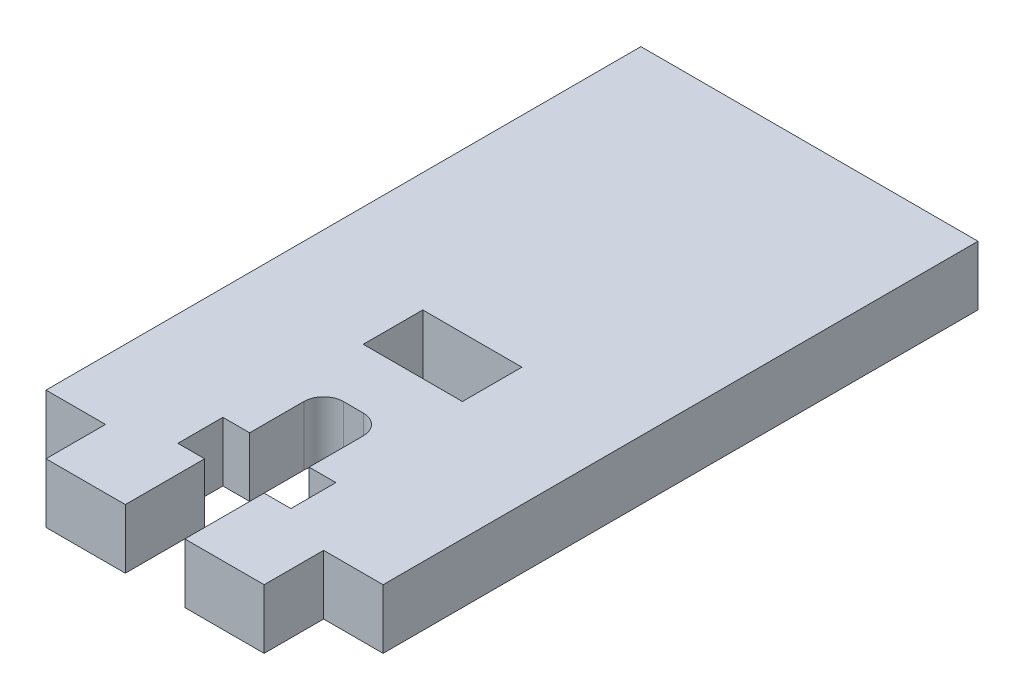
ISO-10303-21;
HEADER;
FILE_DESCRIPTION(('STEP AP214'),'2;1');
FILE_NAME('part.step','',(''),(''),'','','');
FILE_SCHEMA(('AUTOMOTIVE_DESIGN { 1 0 10303 214 1 1 1 1 }'));
ENDSEC;
DATA;
#1=APPLICATION_CONTEXT('core data for automotive mechanical design processes');
#2=APPLICATION_PROTOCOL_DEFINITION('international standard','automotive_design',2000,#1);
#3=PRODUCT_CONTEXT('',#1,'mechanical');
#4=PRODUCT('Part','Part','',(#3));
#5=PRODUCT_RELATED_PRODUCT_CATEGORY('part','',(#4));
#6=PRODUCT_DEFINITION_FORMATION('','',#4);
#7=PRODUCT_DEFINITION_CONTEXT('part definition',#1,'design');
#8=PRODUCT_DEFINITION('design','',#6,#7);
#9=PRODUCT_DEFINITION_SHAPE('','',#8);
#10=(LENGTH_UNIT() NAMED_UNIT(*) SI_UNIT(.MILLI.,.METRE.));
#11=(NAMED_UNIT(*) PLANE_ANGLE_UNIT() SI_UNIT($,.RADIAN.));
#12=(NAMED_UNIT(*) SI_UNIT($,.STERADIAN.) SOLID_ANGLE_UNIT());
#13=UNCERTAINTY_MEASURE_WITH_UNIT(LENGTH_MEASURE(1.E-05),#10,'distance_accuracy_value','');
#14=(GEOMETRIC_REPRESENTATION_CONTEXT(3) GLOBAL_UNCERTAINTY_ASSIGNED_CONTEXT((#13)) GLOBAL_UNIT_ASSIGNED_CONTEXT((#10,
#11,#12)) REPRESENTATION_CONTEXT('',''));
#15=CARTESIAN_POINT('',(0.,0.,0.));
#16=DIRECTION('',(0.,0.,1.));
#17=DIRECTION('',(1.,0.,0.));
#18=AXIS2_PLACEMENT_3D('',#15,#16,#17);
#19=CARTESIAN_POINT('',(-5.5,1.5,18.));
#20=DIRECTION('',(0.,0.,-1.));
#21=DIRECTION('',(-1.,0.,0.));
#22=AXIS2_PLACEMENT_3D('',#19,#20,#21);
#23=PLANE('',#22);
#24=DIRECTION('',(1.,0.,0.));
#25=VECTOR('',#24,1.);
#26=CARTESIAN_POINT('',(-5.5,-1.5,18.));
#27=LINE('',#26,#25);
#28=CARTESIAN_POINT('',(-5.5,-1.5,18.));
#29=VERTEX_POINT('',#28);
#30=CARTESIAN_POINT('',(-1.5,-1.5,18.));
#31=VERTEX_POINT('',#30);
#32=EDGE_CURVE('E227',#29,#31,#27,.T.);
#33=ORIENTED_EDGE('',*,*,#32,.T.);
#34=DIRECTION('',(0.,1.,0.));
#35=VECTOR('',#34,1.);
#36=CARTESIAN_POINT('',(-1.5,-1.5,18.));
#37=LINE('',#36,#35);
#38=CARTESIAN_POINT('',(-1.5,1.5,18.));
#39=VERTEX_POINT('',#38);
#40=EDGE_CURVE('E213',#31,#39,#37,.T.);
#41=ORIENTED_EDGE('',*,*,#40,.T.);
#42=DIRECTION('',(1.,0.,0.));
#43=VECTOR('',#42,1.);
#44=CARTESIAN_POINT('',(-5.5,1.5,18.));
#45=LINE('',#44,#43);
#46=CARTESIAN_POINT('',(-5.5,1.5,18.));
#47=VERTEX_POINT('',#46);
#48=EDGE_CURVE('E225',#47,#39,#45,.T.);
#49=ORIENTED_EDGE('',*,*,#48,.F.);
#50=DIRECTION('',(0.,-1.,0.));
#51=VECTOR('',#50,1.);
#52=CARTESIAN_POINT('',(-5.5,1.5,18.));
#53=LINE('',#52,#51);
#54=EDGE_CURVE('E259',#47,#29,#53,.T.);
#55=ORIENTED_EDGE('',*,*,#54,.T.);
#56=EDGE_LOOP('',(#33,#41,#49,#55));
#57=FACE_BOUND('',#56,.T.);
#58=ADVANCED_FACE('F37',(#57),#23,.F.);
#59=CARTESIAN_POINT('',(-8.5,1.5,15.));
#60=DIRECTION('',(0.,0.,-1.));
#61=DIRECTION('',(-1.,0.,0.));
#62=AXIS2_PLACEMENT_3D('',#59,#60,#61);
#63=PLANE('',#62);
#64=DIRECTION('',(0.,-1.,0.));
#65=VECTOR('',#64,1.);
#66=CARTESIAN_POINT('',(-5.5,1.5,15.));
#67=LINE('',#66,#65);
#68=CARTESIAN_POINT('',(-5.5,1.5,15.));
#69=VERTEX_POINT('',#68);
#70=CARTESIAN_POINT('',(-5.5,-1.5,15.));
#71=VERTEX_POINT('',#70);
#72=EDGE_CURVE('E239',#69,#71,#67,.T.);
#73=ORIENTED_EDGE('',*,*,#72,.F.);
#74=DIRECTION('',(1.,0.,0.));
#75=VECTOR('',#74,1.);
#76=CARTESIAN_POINT('',(-8.5,1.5,15.));
#77=LINE('',#76,#75);
#78=CARTESIAN_POINT('',(-8.5,1.5,15.));
#79=VERTEX_POINT('',#78);
#80=EDGE_CURVE('E267',#79,#69,#77,.T.);
#81=ORIENTED_EDGE('',*,*,#80,.F.);
#82=DIRECTION('',(0.,-1.,0.));
#83=VECTOR('',#82,1.);
#84=CARTESIAN_POINT('',(-8.5,1.5,15.));
#85=LINE('',#84,#83);
#86=CARTESIAN_POINT('',(-8.5,-1.5,15.));
#87=VERTEX_POINT('',#86);
#88=EDGE_CURVE('E11',#79,#87,#85,.T.);
#89=ORIENTED_EDGE('',*,*,#88,.T.);
#90=DIRECTION('',(1.,0.,0.));
#91=VECTOR('',#90,1.);
#92=CARTESIAN_POINT('',(-8.5,-1.5,15.));
#93=LINE('',#92,#91);
#94=EDGE_CURVE('E277',#87,#71,#93,.T.);
#95=ORIENTED_EDGE('',*,*,#94,.T.);
#96=EDGE_LOOP('',(#73,#81,#89,#95));
#97=FACE_BOUND('',#96,.T.);
#98=ADVANCED_FACE('F381',(#97),#63,.F.);
#99=CARTESIAN_POINT('',(-8.5,1.5,-15.));
#100=DIRECTION('',(1.,0.,0.));
#101=DIRECTION('',(0.,0.,-1.));
#102=AXIS2_PLACEMENT_3D('',#99,#100,#101);
#103=PLANE('',#102);
#104=DIRECTION('',(0.,0.,1.));
#105=VECTOR('',#104,1.);
#106=CARTESIAN_POINT('',(-8.5,-1.5,-15.));
#107=LINE('',#106,#105);
#108=CARTESIAN_POINT('',(-8.5,-1.5,-15.));
#109=VERTEX_POINT('',#108);
#110=EDGE_CURVE('E261',#109,#87,#107,.T.);
#111=ORIENTED_EDGE('',*,*,#110,.T.);
#112=ORIENTED_EDGE('',*,*,#88,.F.);
#113=DIRECTION('',(0.,0.,1.));
#114=VECTOR('',#113,1.);
#115=CARTESIAN_POINT('',(-8.5,1.5,-15.));
#116=LINE('',#115,#114);
#117=CARTESIAN_POINT('',(-8.5,1.5,-15.));
#118=VERTEX_POINT('',#117);
#119=EDGE_CURVE('E262',#118,#79,#116,.T.);
#120=ORIENTED_EDGE('',*,*,#119,.F.);
#121=DIRECTION('',(0.,-1.,0.));
#122=VECTOR('',#121,1.);
#123=CARTESIAN_POINT('',(-8.5,1.5,-15.));
#124=LINE('',#123,#122);
#125=EDGE_CURVE('E273',#118,#109,#124,.T.);
#126=ORIENTED_EDGE('',*,*,#125,.T.);
#127=EDGE_LOOP('',(#111,#112,#120,#126));
#128=FACE_BOUND('',#127,.T.);
#129=ADVANCED_FACE('F39',(#128),#103,.F.);
#130=CARTESIAN_POINT('',(5.5,1.5,15.));
#131=VERTEX_POINT('',#130);
#132=CARTESIAN_POINT('',(8.5,1.5,15.));
#133=VERTEX_POINT('',#132);
#134=EDGE_CURVE('E265',#131,#133,#77,.T.);
#135=ORIENTED_EDGE('',*,*,#134,.F.);
#136=DIRECTION('',(0.,-1.,0.));
#137=VECTOR('',#136,1.);
#138=CARTESIAN_POINT('',(5.5,1.5,15.));
#139=LINE('',#138,#137);
#140=CARTESIAN_POINT('',(5.5,-1.5,15.));
#141=VERTEX_POINT('',#140);
#142=EDGE_CURVE('E253',#131,#141,#139,.T.);
#143=ORIENTED_EDGE('',*,*,#142,.T.);
#144=CARTESIAN_POINT('',(8.5,-1.5,15.));
#145=VERTEX_POINT('',#144);
#146=EDGE_CURVE('E276',#141,#145,#93,.T.);
#147=ORIENTED_EDGE('',*,*,#146,.T.);
#148=DIRECTION('',(0.,-1.,0.));
#149=VECTOR('',#148,1.);
#150=CARTESIAN_POINT('',(8.5,1.5,15.));
#151=LINE('',#150,#149);
#152=EDGE_CURVE('E45',#133,#145,#151,.T.);
#153=ORIENTED_EDGE('',*,*,#152,.F.);
#154=EDGE_LOOP('',(#135,#143,#147,#153));
#155=FACE_BOUND('',#154,.T.);
#156=ADVANCED_FACE('F312',(#155),#63,.F.);
#157=CARTESIAN_POINT('',(8.5,1.5,-15.));
#158=DIRECTION('',(-1.,0.,0.));
#159=DIRECTION('',(0.,0.,1.));
#160=AXIS2_PLACEMENT_3D('',#157,#158,#159);
#161=PLANE('',#160);
#162=DIRECTION('',(0.,0.,-1.));
#163=VECTOR('',#162,1.);
#164=CARTESIAN_POINT('',(8.5,-1.5,-15.));
#165=LINE('',#164,#163);
#166=CARTESIAN_POINT('',(8.5,-1.5,-15.));
#167=VERTEX_POINT('',#166);
#168=EDGE_CURVE('E280',#145,#167,#165,.T.);
#169=ORIENTED_EDGE('',*,*,#168,.T.);
#170=DIRECTION('',(0.,-1.,0.));
#171=VECTOR('',#170,1.);
#172=CARTESIAN_POINT('',(8.5,1.5,-15.));
#173=LINE('',#172,#171);
#174=CARTESIAN_POINT('',(8.5,1.5,-15.));
#175=VERTEX_POINT('',#174);
#176=EDGE_CURVE('E285',#175,#167,#173,.T.);
#177=ORIENTED_EDGE('',*,*,#176,.F.);
#178=DIRECTION('',(0.,0.,-1.));
#179=VECTOR('',#178,1.);
#180=CARTESIAN_POINT('',(8.5,1.5,-15.));
#181=LINE('',#180,#179);
#182=EDGE_CURVE('E269',#133,#175,#181,.T.);
#183=ORIENTED_EDGE('',*,*,#182,.F.);
#184=ORIENTED_EDGE('',*,*,#152,.T.);
#185=EDGE_LOOP('',(#169,#177,#183,#184));
#186=FACE_BOUND('',#185,.T.);
#187=ADVANCED_FACE('F292',(#186),#161,.F.);
#188=CARTESIAN_POINT('',(-8.5,1.5,-15.));
#189=DIRECTION('',(0.,0.,1.));
#190=DIRECTION('',(1.,0.,0.));
#191=AXIS2_PLACEMENT_3D('',#188,#189,#190);
#192=PLANE('',#191);
#193=DIRECTION('',(-1.,0.,0.));
#194=VECTOR('',#193,1.);
#195=CARTESIAN_POINT('',(-8.5,-1.5,-15.));
#196=LINE('',#195,#194);
#197=EDGE_CURVE('E266',#167,#109,#196,.T.);
#198=ORIENTED_EDGE('',*,*,#197,.T.);
#199=ORIENTED_EDGE('',*,*,#125,.F.);
#200=DIRECTION('',(-1.,0.,0.));
#201=VECTOR('',#200,1.);
#202=CARTESIAN_POINT('',(-8.5,1.5,-15.));
#203=LINE('',#202,#201);
#204=EDGE_CURVE('E271',#175,#118,#203,.T.);
#205=ORIENTED_EDGE('',*,*,#204,.F.);
#206=ORIENTED_EDGE('',*,*,#176,.T.);
#207=EDGE_LOOP('',(#198,#199,#205,#206));
#208=FACE_BOUND('',#207,.T.);
#209=ADVANCED_FACE('F305',(#208),#192,.F.);
#210=CARTESIAN_POINT('',(0.,1.5,0.));
#211=DIRECTION('',(0.,1.,0.));
#212=DIRECTION('',(0.,0.,1.));
#213=AXIS2_PLACEMENT_3D('',#210,#211,#212);
#214=PLANE('',#213);
#215=DIRECTION('',(0.,0.,1.));
#216=VECTOR('',#215,1.);
#217=CARTESIAN_POINT('',(-1.5,1.5,18.));
#218=LINE('',#217,#216);
#219=CARTESIAN_POINT('',(-1.5,1.5,14.));
#220=VERTEX_POINT('',#219);
#221=EDGE_CURVE('E209',#220,#39,#218,.T.);
#222=ORIENTED_EDGE('',*,*,#221,.F.);
#223=DIRECTION('',(1.,0.,0.));
#224=VECTOR('',#223,1.);
#225=CARTESIAN_POINT('',(-2.85,1.5,14.));
#226=LINE('',#225,#224);
#227=CARTESIAN_POINT('',(-2.85,1.5,14.));
#228=VERTEX_POINT('',#227);
#229=EDGE_CURVE('E701',#228,#220,#226,.T.);
#230=ORIENTED_EDGE('',*,*,#229,.F.);
#231=DIRECTION('',(0.,0.,1.));
#232=VECTOR('',#231,1.);
#233=CARTESIAN_POINT('',(-2.85,1.5,11.73));
#234=LINE('',#233,#232);
#235=CARTESIAN_POINT('',(-2.85,1.5,11.73));
#236=VERTEX_POINT('',#235);
#237=EDGE_CURVE('E698',#236,#228,#234,.T.);
#238=ORIENTED_EDGE('',*,*,#237,.F.);
#239=DIRECTION('',(-1.,0.,0.));
#240=VECTOR('',#239,1.);
#241=CARTESIAN_POINT('',(-2.85,1.5,11.73));
#242=LINE('',#241,#240);
#243=CARTESIAN_POINT('',(-1.5,1.5,11.73));
#244=VERTEX_POINT('',#243);
#245=EDGE_CURVE('E695',#244,#236,#242,.T.);
#246=ORIENTED_EDGE('',*,*,#245,.F.);
#247=DIRECTION('',(0.,0.,1.));
#248=VECTOR('',#247,1.);
#249=CARTESIAN_POINT('',(-1.5,1.5,11.73));
#250=LINE('',#249,#248);
#251=CARTESIAN_POINT('',(-1.5,1.5,9.00000000000001));
#252=VERTEX_POINT('',#251);
#253=EDGE_CURVE('E692',#252,#244,#250,.T.);
#254=ORIENTED_EDGE('',*,*,#253,.F.);
#255=CARTESIAN_POINT('',(-0.500000000000001,1.5,9.));
#256=DIRECTION('',(0.,1.,0.));
#257=DIRECTION('',(0.,0.,-1.));
#258=AXIS2_PLACEMENT_3D('',#255,#256,#257);
#259=CIRCLE('',#258,1.);
#260=CARTESIAN_POINT('',(-0.499999999999993,1.5,8.));
#261=VERTEX_POINT('',#260);
#262=EDGE_CURVE('E689',#261,#252,#259,.T.);
#263=ORIENTED_EDGE('',*,*,#262,.F.);
#264=DIRECTION('',(-1.,0.,0.));
#265=VECTOR('',#264,1.);
#266=CARTESIAN_POINT('',(-0.499999999999993,1.5,8.));
#267=LINE('',#266,#265);
#268=CARTESIAN_POINT('',(0.499999999999993,1.5,8.));
#269=VERTEX_POINT('',#268);
#270=EDGE_CURVE('E686',#269,#261,#267,.T.);
#271=ORIENTED_EDGE('',*,*,#270,.F.);
#272=CARTESIAN_POINT('',(0.5,1.5,9.));
#273=DIRECTION('',(0.,1.,0.));
#274=DIRECTION('',(0.,0.,-1.));
#275=AXIS2_PLACEMENT_3D('',#272,#273,#274);
#276=CIRCLE('',#275,1.);
#277=CARTESIAN_POINT('',(1.5,1.5,9.00000000000001));
#278=VERTEX_POINT('',#277);
#279=EDGE_CURVE('E683',#278,#269,#276,.T.);
#280=ORIENTED_EDGE('',*,*,#279,.F.);
#281=DIRECTION('',(0.,0.,-1.));
#282=VECTOR('',#281,1.);
#283=CARTESIAN_POINT('',(1.5,1.5,11.73));
#284=LINE('',#283,#282);
#285=CARTESIAN_POINT('',(1.5,1.5,11.73));
#286=VERTEX_POINT('',#285);
#287=EDGE_CURVE('E677',#286,#278,#284,.T.);
#288=ORIENTED_EDGE('',*,*,#287,.F.);
#289=DIRECTION('',(-1.,0.,0.));
#290=VECTOR('',#289,1.);
#291=CARTESIAN_POINT('',(1.5,1.5,11.73));
#292=LINE('',#291,#290);
#293=CARTESIAN_POINT('',(2.85,1.5,11.73));
#294=VERTEX_POINT('',#293);
#295=EDGE_CURVE('E675',#294,#286,#292,.T.);
#296=ORIENTED_EDGE('',*,*,#295,.F.);
#297=DIRECTION('',(0.,0.,-1.));
#298=VECTOR('',#297,1.);
#299=CARTESIAN_POINT('',(2.85,1.5,11.73));
#300=LINE('',#299,#298);
#301=CARTESIAN_POINT('',(2.85,1.5,14.));
#302=VERTEX_POINT('',#301);
#303=EDGE_CURVE('E669',#302,#294,#300,.T.);
#304=ORIENTED_EDGE('',*,*,#303,.F.);
#305=DIRECTION('',(1.,0.,0.));
#306=VECTOR('',#305,1.);
#307=CARTESIAN_POINT('',(1.5,1.5,14.));
#308=LINE('',#307,#306);
#309=CARTESIAN_POINT('',(1.5,1.5,14.));
#310=VERTEX_POINT('',#309);
#311=EDGE_CURVE('E671',#310,#302,#308,.T.);
#312=ORIENTED_EDGE('',*,*,#311,.F.);
#313=DIRECTION('',(0.,0.,-1.));
#314=VECTOR('',#313,1.);
#315=CARTESIAN_POINT('',(1.5,1.5,18.));
#316=LINE('',#315,#314);
#317=CARTESIAN_POINT('',(1.5,1.5,18.));
#318=VERTEX_POINT('',#317);
#319=EDGE_CURVE('E220',#318,#310,#316,.T.);
#320=ORIENTED_EDGE('',*,*,#319,.F.);
#321=CARTESIAN_POINT('',(5.5,1.5,18.));
#322=VERTEX_POINT('',#321);
#323=EDGE_CURVE('E237',#318,#322,#45,.T.);
#324=ORIENTED_EDGE('',*,*,#323,.T.);
#325=DIRECTION('',(0.,0.,-1.));
#326=VECTOR('',#325,1.);
#327=CARTESIAN_POINT('',(5.5,1.5,15.));
#328=LINE('',#327,#326);
#329=EDGE_CURVE('E236',#322,#131,#328,.T.);
#330=ORIENTED_EDGE('',*,*,#329,.T.);
#331=ORIENTED_EDGE('',*,*,#134,.T.);
#332=ORIENTED_EDGE('',*,*,#182,.T.);
#333=ORIENTED_EDGE('',*,*,#204,.T.);
#334=ORIENTED_EDGE('',*,*,#119,.T.);
#335=ORIENTED_EDGE('',*,*,#80,.T.);
#336=DIRECTION('',(0.,0.,1.));
#337=VECTOR('',#336,1.);
#338=CARTESIAN_POINT('',(-5.5,1.5,15.));
#339=LINE('',#338,#337);
#340=EDGE_CURVE('E234',#69,#47,#339,.T.);
#341=ORIENTED_EDGE('',*,*,#340,.T.);
#342=ORIENTED_EDGE('',*,*,#48,.T.);
#343=EDGE_LOOP('',(#222,#230,#238,#246,#254,#263,#271,#280,#288,#296,#304,#312,#320,#324,#330,
#331,#332,#333,#334,#335,#341,#342));
#344=FACE_BOUND('',#343,.T.);
#345=DIRECTION('',(0.,0.,1.));
#346=VECTOR('',#345,1.);
#347=CARTESIAN_POINT('',(-2.5,1.5,2.));
#348=LINE('',#347,#346);
#349=CARTESIAN_POINT('',(-2.5,1.5,2.));
#350=VERTEX_POINT('',#349);
#351=CARTESIAN_POINT('',(-2.5,1.5,5.));
#352=VERTEX_POINT('',#351);
#353=EDGE_CURVE('E60',#350,#352,#348,.T.);
#354=ORIENTED_EDGE('',*,*,#353,.F.);
#355=DIRECTION('',(-1.,0.,0.));
#356=VECTOR('',#355,1.);
#357=CARTESIAN_POINT('',(-2.5,1.5,2.));
#358=LINE('',#357,#356);
#359=CARTESIAN_POINT('',(2.5,1.5,2.));
#360=VERTEX_POINT('',#359);
#361=EDGE_CURVE('E336',#360,#350,#358,.T.);
#362=ORIENTED_EDGE('',*,*,#361,.F.);
#363=DIRECTION('',(0.,0.,-1.));
#364=VECTOR('',#363,1.);
#365=CARTESIAN_POINT('',(2.5,1.5,2.));
#366=LINE('',#365,#364);
#367=CARTESIAN_POINT('',(2.5,1.5,5.));
#368=VERTEX_POINT('',#367);
#369=EDGE_CURVE('E333',#368,#360,#366,.T.);
#370=ORIENTED_EDGE('',*,*,#369,.F.);
#371=DIRECTION('',(1.,0.,0.));
#372=VECTOR('',#371,1.);
#373=CARTESIAN_POINT('',(-2.5,1.5,5.));
#374=LINE('',#373,#372);
#375=EDGE_CURVE('E330',#352,#368,#374,.T.);
#376=ORIENTED_EDGE('',*,*,#375,.F.);
#377=EDGE_LOOP('',(#354,#362,#370,#376));
#378=FACE_BOUND('',#377,.T.);
#379=ADVANCED_FACE('F231',(#344,#378),#214,.T.);
#380=CARTESIAN_POINT('',(0.,-1.5,0.));
#381=DIRECTION('',(0.,1.,0.));
#382=DIRECTION('',(0.,0.,1.));
#383=AXIS2_PLACEMENT_3D('',#380,#381,#382);
#384=PLANE('',#383);
#385=DIRECTION('',(-1.,0.,0.));
#386=VECTOR('',#385,1.);
#387=CARTESIAN_POINT('',(-2.5,-1.5,2.));
#388=LINE('',#387,#386);
#389=CARTESIAN_POINT('',(2.5,-1.5,2.));
#390=VERTEX_POINT('',#389);
#391=CARTESIAN_POINT('',(-2.5,-1.5,2.));
#392=VERTEX_POINT('',#391);
#393=EDGE_CURVE('E348',#390,#392,#388,.T.);
#394=ORIENTED_EDGE('',*,*,#393,.T.);
#395=DIRECTION('',(0.,0.,1.));
#396=VECTOR('',#395,1.);
#397=CARTESIAN_POINT('',(-2.5,-1.5,2.));
#398=LINE('',#397,#396);
#399=CARTESIAN_POINT('',(-2.5,-1.5,5.));
#400=VERTEX_POINT('',#399);
#401=EDGE_CURVE('E339',#392,#400,#398,.T.);
#402=ORIENTED_EDGE('',*,*,#401,.T.);
#403=DIRECTION('',(1.,0.,0.));
#404=VECTOR('',#403,1.);
#405=CARTESIAN_POINT('',(-2.5,-1.5,5.));
#406=LINE('',#405,#404);
#407=CARTESIAN_POINT('',(2.5,-1.5,5.));
#408=VERTEX_POINT('',#407);
#409=EDGE_CURVE('E342',#400,#408,#406,.T.);
#410=ORIENTED_EDGE('',*,*,#409,.T.);
#411=DIRECTION('',(0.,0.,-1.));
#412=VECTOR('',#411,1.);
#413=CARTESIAN_POINT('',(2.5,-1.5,2.));
#414=LINE('',#413,#412);
#415=EDGE_CURVE('E345',#408,#390,#414,.T.);
#416=ORIENTED_EDGE('',*,*,#415,.T.);
#417=EDGE_LOOP('',(#394,#402,#410,#416));
#418=FACE_BOUND('',#417,.T.);
#419=DIRECTION('',(1.,0.,0.));
#420=VECTOR('',#419,1.);
#421=CARTESIAN_POINT('',(-2.85,-1.5,14.));
#422=LINE('',#421,#420);
#423=CARTESIAN_POINT('',(-2.85,-1.5,14.));
#424=VERTEX_POINT('',#423);
#425=CARTESIAN_POINT('',(-1.5,-1.5,14.));
#426=VERTEX_POINT('',#425);
#427=EDGE_CURVE('E229',#424,#426,#422,.T.);
#428=ORIENTED_EDGE('',*,*,#427,.T.);
#429=DIRECTION('',(0.,0.,1.));
#430=VECTOR('',#429,1.);
#431=CARTESIAN_POINT('',(-1.5,-1.5,18.));
#432=LINE('',#431,#430);
#433=EDGE_CURVE('E621',#426,#31,#432,.T.);
#434=ORIENTED_EDGE('',*,*,#433,.T.);
#435=ORIENTED_EDGE('',*,*,#32,.F.);
#436=DIRECTION('',(0.,0.,1.));
#437=VECTOR('',#436,1.);
#438=CARTESIAN_POINT('',(-5.5,-1.5,15.));
#439=LINE('',#438,#437);
#440=EDGE_CURVE('E244',#71,#29,#439,.T.);
#441=ORIENTED_EDGE('',*,*,#440,.F.);
#442=ORIENTED_EDGE('',*,*,#94,.F.);
#443=ORIENTED_EDGE('',*,*,#110,.F.);
#444=ORIENTED_EDGE('',*,*,#197,.F.);
#445=ORIENTED_EDGE('',*,*,#168,.F.);
#446=ORIENTED_EDGE('',*,*,#146,.F.);
#447=DIRECTION('',(0.,0.,-1.));
#448=VECTOR('',#447,1.);
#449=CARTESIAN_POINT('',(5.5,-1.5,15.));
#450=LINE('',#449,#448);
#451=CARTESIAN_POINT('',(5.5,-1.5,18.));
#452=VERTEX_POINT('',#451);
#453=EDGE_CURVE('E250',#452,#141,#450,.T.);
#454=ORIENTED_EDGE('',*,*,#453,.F.);
#455=CARTESIAN_POINT('',(1.5,-1.5,18.));
#456=VERTEX_POINT('',#455);
#457=EDGE_CURVE('E247',#456,#452,#27,.T.);
#458=ORIENTED_EDGE('',*,*,#457,.F.);
#459=DIRECTION('',(0.,0.,-1.));
#460=VECTOR('',#459,1.);
#461=CARTESIAN_POINT('',(1.5,-1.5,18.));
#462=LINE('',#461,#460);
#463=CARTESIAN_POINT('',(1.5,-1.5,14.));
#464=VERTEX_POINT('',#463);
#465=EDGE_CURVE('E52',#456,#464,#462,.T.);
#466=ORIENTED_EDGE('',*,*,#465,.T.);
#467=DIRECTION('',(1.,0.,0.));
#468=VECTOR('',#467,1.);
#469=CARTESIAN_POINT('',(1.5,-1.5,14.));
#470=LINE('',#469,#468);
#471=CARTESIAN_POINT('',(2.85,-1.5,14.));
#472=VERTEX_POINT('',#471);
#473=EDGE_CURVE('E614',#464,#472,#470,.T.);
#474=ORIENTED_EDGE('',*,*,#473,.T.);
#475=DIRECTION('',(0.,0.,-1.));
#476=VECTOR('',#475,1.);
#477=CARTESIAN_POINT('',(2.85,-1.5,11.73));
#478=LINE('',#477,#476);
#479=CARTESIAN_POINT('',(2.85,-1.5,11.73));
#480=VERTEX_POINT('',#479);
#481=EDGE_CURVE('E617',#472,#480,#478,.T.);
#482=ORIENTED_EDGE('',*,*,#481,.T.);
#483=DIRECTION('',(-1.,0.,0.));
#484=VECTOR('',#483,1.);
#485=CARTESIAN_POINT('',(1.5,-1.5,11.73));
#486=LINE('',#485,#484);
#487=CARTESIAN_POINT('',(1.5,-1.5,11.73));
#488=VERTEX_POINT('',#487);
#489=EDGE_CURVE('E619',#480,#488,#486,.T.);
#490=ORIENTED_EDGE('',*,*,#489,.T.);
#491=DIRECTION('',(0.,0.,-1.));
#492=VECTOR('',#491,1.);
#493=CARTESIAN_POINT('',(1.5,-1.5,11.73));
#494=LINE('',#493,#492);
#495=CARTESIAN_POINT('',(1.5,-1.5,9.00000000000001));
#496=VERTEX_POINT('',#495);
#497=EDGE_CURVE('E627',#488,#496,#494,.T.);
#498=ORIENTED_EDGE('',*,*,#497,.T.);
#499=CARTESIAN_POINT('',(0.5,-1.5,9.));
#500=DIRECTION('',(0.,1.,0.));
#501=DIRECTION('',(0.,0.,-1.));
#502=AXIS2_PLACEMENT_3D('',#499,#500,#501);
#503=CIRCLE('',#502,1.);
#504=CARTESIAN_POINT('',(0.499999999999993,-1.5,8.));
#505=VERTEX_POINT('',#504);
#506=EDGE_CURVE('E630',#496,#505,#503,.T.);
#507=ORIENTED_EDGE('',*,*,#506,.T.);
#508=DIRECTION('',(-1.,0.,0.));
#509=VECTOR('',#508,1.);
#510=CARTESIAN_POINT('',(-0.499999999999993,-1.5,8.));
#511=LINE('',#510,#509);
#512=CARTESIAN_POINT('',(-0.499999999999993,-1.5,8.));
#513=VERTEX_POINT('',#512);
#514=EDGE_CURVE('E633',#505,#513,#511,.T.);
#515=ORIENTED_EDGE('',*,*,#514,.T.);
#516=CARTESIAN_POINT('',(-0.500000000000001,-1.5,9.));
#517=DIRECTION('',(0.,1.,0.));
#518=DIRECTION('',(0.,0.,-1.));
#519=AXIS2_PLACEMENT_3D('',#516,#517,#518);
#520=CIRCLE('',#519,1.);
#521=CARTESIAN_POINT('',(-1.5,-1.5,9.00000000000001));
#522=VERTEX_POINT('',#521);
#523=EDGE_CURVE('E636',#513,#522,#520,.T.);
#524=ORIENTED_EDGE('',*,*,#523,.T.);
#525=DIRECTION('',(0.,0.,1.));
#526=VECTOR('',#525,1.);
#527=CARTESIAN_POINT('',(-1.5,-1.5,11.73));
#528=LINE('',#527,#526);
#529=CARTESIAN_POINT('',(-1.5,-1.5,11.73));
#530=VERTEX_POINT('',#529);
#531=EDGE_CURVE('E639',#522,#530,#528,.T.);
#532=ORIENTED_EDGE('',*,*,#531,.T.);
#533=DIRECTION('',(-1.,0.,0.));
#534=VECTOR('',#533,1.);
#535=CARTESIAN_POINT('',(-2.85,-1.5,11.73));
#536=LINE('',#535,#534);
#537=CARTESIAN_POINT('',(-2.85,-1.5,11.73));
#538=VERTEX_POINT('',#537);
#539=EDGE_CURVE('E642',#530,#538,#536,.T.);
#540=ORIENTED_EDGE('',*,*,#539,.T.);
#541=DIRECTION('',(0.,0.,1.));
#542=VECTOR('',#541,1.);
#543=CARTESIAN_POINT('',(-2.85,-1.5,11.73));
#544=LINE('',#543,#542);
#545=EDGE_CURVE('E645',#538,#424,#544,.T.);
#546=ORIENTED_EDGE('',*,*,#545,.T.);
#547=EDGE_LOOP('',(#428,#434,#435,#441,#442,#443,#444,#445,#446,#454,#458,#466,#474,#482,#490,
#498,#507,#515,#524,#532,#540,#546));
#548=FACE_BOUND('',#547,.T.);
#549=ADVANCED_FACE('F300',(#418,#548),#384,.F.);
#550=CARTESIAN_POINT('',(-5.5,1.5,15.));
#551=DIRECTION('',(1.,0.,0.));
#552=DIRECTION('',(0.,0.,-1.));
#553=AXIS2_PLACEMENT_3D('',#550,#551,#552);
#554=PLANE('',#553);
#555=ORIENTED_EDGE('',*,*,#440,.T.);
#556=ORIENTED_EDGE('',*,*,#54,.F.);
#557=ORIENTED_EDGE('',*,*,#340,.F.);
#558=ORIENTED_EDGE('',*,*,#72,.T.);
#559=EDGE_LOOP('',(#555,#556,#557,#558));
#560=FACE_BOUND('',#559,.T.);
#561=ADVANCED_FACE('F390',(#560),#554,.F.);
#562=ORIENTED_EDGE('',*,*,#323,.F.);
#563=DIRECTION('',(0.,1.,0.));
#564=VECTOR('',#563,1.);
#565=CARTESIAN_POINT('',(1.5,-1.5,18.));
#566=LINE('',#565,#564);
#567=EDGE_CURVE('E228',#456,#318,#566,.T.);
#568=ORIENTED_EDGE('',*,*,#567,.F.);
#569=ORIENTED_EDGE('',*,*,#457,.T.);
#570=DIRECTION('',(0.,-1.,0.));
#571=VECTOR('',#570,1.);
#572=CARTESIAN_POINT('',(5.5,1.5,18.));
#573=LINE('',#572,#571);
#574=EDGE_CURVE('E256',#322,#452,#573,.T.);
#575=ORIENTED_EDGE('',*,*,#574,.F.);
#576=EDGE_LOOP('',(#562,#568,#569,#575));
#577=FACE_BOUND('',#576,.T.);
#578=ADVANCED_FACE('F320',(#577),#23,.F.);
#579=CARTESIAN_POINT('',(5.5,1.5,15.));
#580=DIRECTION('',(-1.,0.,0.));
#581=DIRECTION('',(0.,0.,1.));
#582=AXIS2_PLACEMENT_3D('',#579,#580,#581);
#583=PLANE('',#582);
#584=ORIENTED_EDGE('',*,*,#453,.T.);
#585=ORIENTED_EDGE('',*,*,#142,.F.);
#586=ORIENTED_EDGE('',*,*,#329,.F.);
#587=ORIENTED_EDGE('',*,*,#574,.T.);
#588=EDGE_LOOP('',(#584,#585,#586,#587));
#589=FACE_BOUND('',#588,.T.);
#590=ADVANCED_FACE('F314',(#589),#583,.F.);
#591=CARTESIAN_POINT('',(-2.5,-1.5,2.));
#592=DIRECTION('',(-1.,0.,0.));
#593=DIRECTION('',(0.,0.,1.));
#594=AXIS2_PLACEMENT_3D('',#591,#592,#593);
#595=PLANE('',#594);
#596=DIRECTION('',(0.,1.,0.));
#597=VECTOR('',#596,1.);
#598=CARTESIAN_POINT('',(-2.5,-1.5,5.));
#599=LINE('',#598,#597);
#600=EDGE_CURVE('E351',#400,#352,#599,.T.);
#601=ORIENTED_EDGE('',*,*,#600,.F.);
#602=ORIENTED_EDGE('',*,*,#401,.F.);
#603=DIRECTION('',(0.,1.,0.));
#604=VECTOR('',#603,1.);
#605=CARTESIAN_POINT('',(-2.5,-1.5,2.));
#606=LINE('',#605,#604);
#607=EDGE_CURVE('E248',#392,#350,#606,.T.);
#608=ORIENTED_EDGE('',*,*,#607,.T.);
#609=ORIENTED_EDGE('',*,*,#353,.T.);
#610=EDGE_LOOP('',(#601,#602,#608,#609));
#611=FACE_BOUND('',#610,.T.);
#612=ADVANCED_FACE('F368',(#611),#595,.F.);
#613=CARTESIAN_POINT('',(-2.5,-1.5,2.));
#614=DIRECTION('',(0.,0.,-1.));
#615=DIRECTION('',(-1.,0.,0.));
#616=AXIS2_PLACEMENT_3D('',#613,#614,#615);
#617=PLANE('',#616);
#618=ORIENTED_EDGE('',*,*,#607,.F.);
#619=ORIENTED_EDGE('',*,*,#393,.F.);
#620=DIRECTION('',(0.,1.,0.));
#621=VECTOR('',#620,1.);
#622=CARTESIAN_POINT('',(2.5,-1.5,2.));
#623=LINE('',#622,#621);
#624=EDGE_CURVE('E353',#390,#360,#623,.T.);
#625=ORIENTED_EDGE('',*,*,#624,.T.);
#626=ORIENTED_EDGE('',*,*,#361,.T.);
#627=EDGE_LOOP('',(#618,#619,#625,#626));
#628=FACE_BOUND('',#627,.T.);
#629=ADVANCED_FACE('F370',(#628),#617,.F.);
#630=CARTESIAN_POINT('',(2.5,-1.5,2.));
#631=DIRECTION('',(1.,0.,0.));
#632=DIRECTION('',(0.,0.,-1.));
#633=AXIS2_PLACEMENT_3D('',#630,#631,#632);
#634=PLANE('',#633);
#635=ORIENTED_EDGE('',*,*,#624,.F.);
#636=ORIENTED_EDGE('',*,*,#415,.F.);
#637=DIRECTION('',(0.,1.,0.));
#638=VECTOR('',#637,1.);
#639=CARTESIAN_POINT('',(2.5,-1.5,5.));
#640=LINE('',#639,#638);
#641=EDGE_CURVE('E355',#408,#368,#640,.T.);
#642=ORIENTED_EDGE('',*,*,#641,.T.);
#643=ORIENTED_EDGE('',*,*,#369,.T.);
#644=EDGE_LOOP('',(#635,#636,#642,#643));
#645=FACE_BOUND('',#644,.T.);
#646=ADVANCED_FACE('F365',(#645),#634,.F.);
#647=CARTESIAN_POINT('',(-2.5,-1.5,5.));
#648=DIRECTION('',(0.,0.,1.));
#649=DIRECTION('',(1.,0.,0.));
#650=AXIS2_PLACEMENT_3D('',#647,#648,#649);
#651=PLANE('',#650);
#652=ORIENTED_EDGE('',*,*,#641,.F.);
#653=ORIENTED_EDGE('',*,*,#409,.F.);
#654=ORIENTED_EDGE('',*,*,#600,.T.);
#655=ORIENTED_EDGE('',*,*,#375,.T.);
#656=EDGE_LOOP('',(#652,#653,#654,#655));
#657=FACE_BOUND('',#656,.T.);
#658=ADVANCED_FACE('F360',(#657),#651,.F.);
#659=CARTESIAN_POINT('',(-1.5,-1.5,18.));
#660=DIRECTION('',(-1.,0.,0.));
#661=DIRECTION('',(0.,0.,1.));
#662=AXIS2_PLACEMENT_3D('',#659,#660,#661);
#663=PLANE('',#662);
#664=ORIENTED_EDGE('',*,*,#40,.F.);
#665=ORIENTED_EDGE('',*,*,#433,.F.);
#666=DIRECTION('',(0.,1.,0.));
#667=VECTOR('',#666,1.);
#668=CARTESIAN_POINT('',(-1.5,-1.5,14.));
#669=LINE('',#668,#667);
#670=EDGE_CURVE('E215',#426,#220,#669,.T.);
#671=ORIENTED_EDGE('',*,*,#670,.T.);
#672=ORIENTED_EDGE('',*,*,#221,.T.);
#673=EDGE_LOOP('',(#664,#665,#671,#672));
#674=FACE_BOUND('',#673,.T.);
#675=ADVANCED_FACE('F211',(#674),#663,.F.);
#676=CARTESIAN_POINT('',(-2.85,-1.5,14.));
#677=DIRECTION('',(0.,0.,1.));
#678=DIRECTION('',(1.,0.,0.));
#679=AXIS2_PLACEMENT_3D('',#676,#677,#678);
#680=PLANE('',#679);
#681=ORIENTED_EDGE('',*,*,#670,.F.);
#682=ORIENTED_EDGE('',*,*,#427,.F.);
#683=DIRECTION('',(0.,1.,0.));
#684=VECTOR('',#683,1.);
#685=CARTESIAN_POINT('',(-2.85,-1.5,14.));
#686=LINE('',#685,#684);
#687=EDGE_CURVE('E650',#424,#228,#686,.T.);
#688=ORIENTED_EDGE('',*,*,#687,.T.);
#689=ORIENTED_EDGE('',*,*,#229,.T.);
#690=EDGE_LOOP('',(#681,#682,#688,#689));
#691=FACE_BOUND('',#690,.T.);
#692=ADVANCED_FACE('F490',(#691),#680,.F.);
#693=CARTESIAN_POINT('',(-2.85,-1.5,11.73));
#694=DIRECTION('',(-1.,0.,0.));
#695=DIRECTION('',(0.,0.,1.));
#696=AXIS2_PLACEMENT_3D('',#693,#694,#695);
#697=PLANE('',#696);
#698=ORIENTED_EDGE('',*,*,#687,.F.);
#699=ORIENTED_EDGE('',*,*,#545,.F.);
#700=DIRECTION('',(0.,1.,0.));
#701=VECTOR('',#700,1.);
#702=CARTESIAN_POINT('',(-2.85,-1.5,11.73));
#703=LINE('',#702,#701);
#704=EDGE_CURVE('E652',#538,#236,#703,.T.);
#705=ORIENTED_EDGE('',*,*,#704,.T.);
#706=ORIENTED_EDGE('',*,*,#237,.T.);
#707=EDGE_LOOP('',(#698,#699,#705,#706));
#708=FACE_BOUND('',#707,.T.);
#709=ADVANCED_FACE('F498',(#708),#697,.F.);
#710=CARTESIAN_POINT('',(-2.85,-1.5,11.73));
#711=DIRECTION('',(0.,0.,-1.));
#712=DIRECTION('',(-1.,0.,0.));
#713=AXIS2_PLACEMENT_3D('',#710,#711,#712);
#714=PLANE('',#713);
#715=ORIENTED_EDGE('',*,*,#704,.F.);
#716=ORIENTED_EDGE('',*,*,#539,.F.);
#717=DIRECTION('',(0.,1.,0.));
#718=VECTOR('',#717,1.);
#719=CARTESIAN_POINT('',(-1.5,-1.5,11.73));
#720=LINE('',#719,#718);
#721=EDGE_CURVE('E654',#530,#244,#720,.T.);
#722=ORIENTED_EDGE('',*,*,#721,.T.);
#723=ORIENTED_EDGE('',*,*,#245,.T.);
#724=EDGE_LOOP('',(#715,#716,#722,#723));
#725=FACE_BOUND('',#724,.T.);
#726=ADVANCED_FACE('F508',(#725),#714,.F.);
#727=CARTESIAN_POINT('',(-1.5,-1.5,11.73));
#728=DIRECTION('',(-1.,0.,0.));
#729=DIRECTION('',(0.,0.,1.));
#730=AXIS2_PLACEMENT_3D('',#727,#728,#729);
#731=PLANE('',#730);
#732=ORIENTED_EDGE('',*,*,#721,.F.);
#733=ORIENTED_EDGE('',*,*,#531,.F.);
#734=DIRECTION('',(0.,1.,0.));
#735=VECTOR('',#734,1.);
#736=CARTESIAN_POINT('',(-1.5,-1.5,9.00000000000001));
#737=LINE('',#736,#735);
#738=EDGE_CURVE('E656',#522,#252,#737,.T.);
#739=ORIENTED_EDGE('',*,*,#738,.T.);
#740=ORIENTED_EDGE('',*,*,#253,.T.);
#741=EDGE_LOOP('',(#732,#733,#739,#740));
#742=FACE_BOUND('',#741,.T.);
#743=ADVANCED_FACE('F518',(#742),#731,.F.);
#744=CARTESIAN_POINT('',(-0.500000000000001,-1.5,9.));
#745=DIRECTION('',(0.,1.,0.));
#746=DIRECTION('',(0.,0.,1.));
#747=AXIS2_PLACEMENT_3D('',#744,#745,#746);
#748=CYLINDRICAL_SURFACE('',#747,1.);
#749=ORIENTED_EDGE('',*,*,#738,.F.);
#750=ORIENTED_EDGE('',*,*,#523,.F.);
#751=DIRECTION('',(0.,1.,0.));
#752=VECTOR('',#751,1.);
#753=CARTESIAN_POINT('',(-0.499999999999993,-1.5,8.));
#754=LINE('',#753,#752);
#755=EDGE_CURVE('E658',#513,#261,#754,.T.);
#756=ORIENTED_EDGE('',*,*,#755,.T.);
#757=ORIENTED_EDGE('',*,*,#262,.T.);
#758=EDGE_LOOP('',(#749,#750,#756,#757));
#759=FACE_BOUND('',#758,.T.);
#760=ADVANCED_FACE('F528',(#759),#748,.F.);
#761=CARTESIAN_POINT('',(-0.499999999999993,-1.5,8.));
#762=DIRECTION('',(0.,0.,-1.));
#763=DIRECTION('',(-1.,0.,0.));
#764=AXIS2_PLACEMENT_3D('',#761,#762,#763);
#765=PLANE('',#764);
#766=ORIENTED_EDGE('',*,*,#755,.F.);
#767=ORIENTED_EDGE('',*,*,#514,.F.);
#768=DIRECTION('',(0.,1.,0.));
#769=VECTOR('',#768,1.);
#770=CARTESIAN_POINT('',(0.499999999999993,-1.5,8.));
#771=LINE('',#770,#769);
#772=EDGE_CURVE('E660',#505,#269,#771,.T.);
#773=ORIENTED_EDGE('',*,*,#772,.T.);
#774=ORIENTED_EDGE('',*,*,#270,.T.);
#775=EDGE_LOOP('',(#766,#767,#773,#774));
#776=FACE_BOUND('',#775,.T.);
#777=ADVANCED_FACE('F538',(#776),#765,.F.);
#778=CARTESIAN_POINT('',(0.5,-1.5,9.));
#779=DIRECTION('',(0.,1.,0.));
#780=DIRECTION('',(0.,0.,1.));
#781=AXIS2_PLACEMENT_3D('',#778,#779,#780);
#782=CYLINDRICAL_SURFACE('',#781,1.);
#783=ORIENTED_EDGE('',*,*,#772,.F.);
#784=ORIENTED_EDGE('',*,*,#506,.F.);
#785=DIRECTION('',(0.,1.,0.));
#786=VECTOR('',#785,1.);
#787=CARTESIAN_POINT('',(1.5,-1.5,9.00000000000001));
#788=LINE('',#787,#786);
#789=EDGE_CURVE('E662',#496,#278,#788,.T.);
#790=ORIENTED_EDGE('',*,*,#789,.T.);
#791=ORIENTED_EDGE('',*,*,#279,.T.);
#792=EDGE_LOOP('',(#783,#784,#790,#791));
#793=FACE_BOUND('',#792,.T.);
#794=ADVANCED_FACE('F548',(#793),#782,.F.);
#795=CARTESIAN_POINT('',(1.5,-1.5,11.73));
#796=DIRECTION('',(1.,0.,0.));
#797=DIRECTION('',(0.,0.,-1.));
#798=AXIS2_PLACEMENT_3D('',#795,#796,#797);
#799=PLANE('',#798);
#800=ORIENTED_EDGE('',*,*,#789,.F.);
#801=ORIENTED_EDGE('',*,*,#497,.F.);
#802=DIRECTION('',(0.,1.,0.));
#803=VECTOR('',#802,1.);
#804=CARTESIAN_POINT('',(1.5,-1.5,11.73));
#805=LINE('',#804,#803);
#806=EDGE_CURVE('E664',#488,#286,#805,.T.);
#807=ORIENTED_EDGE('',*,*,#806,.T.);
#808=ORIENTED_EDGE('',*,*,#287,.T.);
#809=EDGE_LOOP('',(#800,#801,#807,#808));
#810=FACE_BOUND('',#809,.T.);
#811=ADVANCED_FACE('F558',(#810),#799,.F.);
#812=CARTESIAN_POINT('',(1.5,-1.5,11.73));
#813=DIRECTION('',(0.,0.,-1.));
#814=DIRECTION('',(-1.,0.,0.));
#815=AXIS2_PLACEMENT_3D('',#812,#813,#814);
#816=PLANE('',#815);
#817=ORIENTED_EDGE('',*,*,#806,.F.);
#818=ORIENTED_EDGE('',*,*,#489,.F.);
#819=DIRECTION('',(0.,1.,0.));
#820=VECTOR('',#819,1.);
#821=CARTESIAN_POINT('',(2.85,-1.5,11.73));
#822=LINE('',#821,#820);
#823=EDGE_CURVE('E666',#480,#294,#822,.T.);
#824=ORIENTED_EDGE('',*,*,#823,.T.);
#825=ORIENTED_EDGE('',*,*,#295,.T.);
#826=EDGE_LOOP('',(#817,#818,#824,#825));
#827=FACE_BOUND('',#826,.T.);
#828=ADVANCED_FACE('F568',(#827),#816,.F.);
#829=CARTESIAN_POINT('',(2.85,-1.5,11.73));
#830=DIRECTION('',(1.,0.,0.));
#831=DIRECTION('',(0.,0.,-1.));
#832=AXIS2_PLACEMENT_3D('',#829,#830,#831);
#833=PLANE('',#832);
#834=ORIENTED_EDGE('',*,*,#823,.F.);
#835=ORIENTED_EDGE('',*,*,#481,.F.);
#836=DIRECTION('',(0.,1.,0.));
#837=VECTOR('',#836,1.);
#838=CARTESIAN_POINT('',(2.85,-1.5,14.));
#839=LINE('',#838,#837);
#840=EDGE_CURVE('E325',#472,#302,#839,.T.);
#841=ORIENTED_EDGE('',*,*,#840,.T.);
#842=ORIENTED_EDGE('',*,*,#303,.T.);
#843=EDGE_LOOP('',(#834,#835,#841,#842));
#844=FACE_BOUND('',#843,.T.);
#845=ADVANCED_FACE('F578',(#844),#833,.F.);
#846=CARTESIAN_POINT('',(1.5,-1.5,14.));
#847=DIRECTION('',(0.,0.,1.));
#848=DIRECTION('',(1.,0.,0.));
#849=AXIS2_PLACEMENT_3D('',#846,#847,#848);
#850=PLANE('',#849);
#851=ORIENTED_EDGE('',*,*,#840,.F.);
#852=ORIENTED_EDGE('',*,*,#473,.F.);
#853=DIRECTION('',(0.,1.,0.));
#854=VECTOR('',#853,1.);
#855=CARTESIAN_POINT('',(1.5,-1.5,14.));
#856=LINE('',#855,#854);
#857=EDGE_CURVE('E323',#464,#310,#856,.T.);
#858=ORIENTED_EDGE('',*,*,#857,.T.);
#859=ORIENTED_EDGE('',*,*,#311,.T.);
#860=EDGE_LOOP('',(#851,#852,#858,#859));
#861=FACE_BOUND('',#860,.T.);
#862=ADVANCED_FACE('F588',(#861),#850,.F.);
#863=CARTESIAN_POINT('',(1.5,-1.5,18.));
#864=DIRECTION('',(1.,0.,0.));
#865=DIRECTION('',(0.,0.,-1.));
#866=AXIS2_PLACEMENT_3D('',#863,#864,#865);
#867=PLANE('',#866);
#868=ORIENTED_EDGE('',*,*,#857,.F.);
#869=ORIENTED_EDGE('',*,*,#465,.F.);
#870=ORIENTED_EDGE('',*,*,#567,.T.);
#871=ORIENTED_EDGE('',*,*,#319,.T.);
#872=EDGE_LOOP('',(#868,#869,#870,#871));
#873=FACE_BOUND('',#872,.T.);
#874=ADVANCED_FACE('F598',(#873),#867,.F.);
#875=CLOSED_SHELL('',(#58,#98,#129,#156,#187,#209,#379,#549,#561,#578,#590,#612,#629,#646,#658,
#675,#692,#709,#726,#743,#760,#777,#794,#811,#828,#845,#862,#874));
#876=MANIFOLD_SOLID_BREP('B2',#875);
#877=ADVANCED_BREP_SHAPE_REPRESENTATION('',(#18,#876),#14);
#878=SHAPE_DEFINITION_REPRESENTATION(#9,#877);
ENDSEC;
END-ISO-10303-21;
